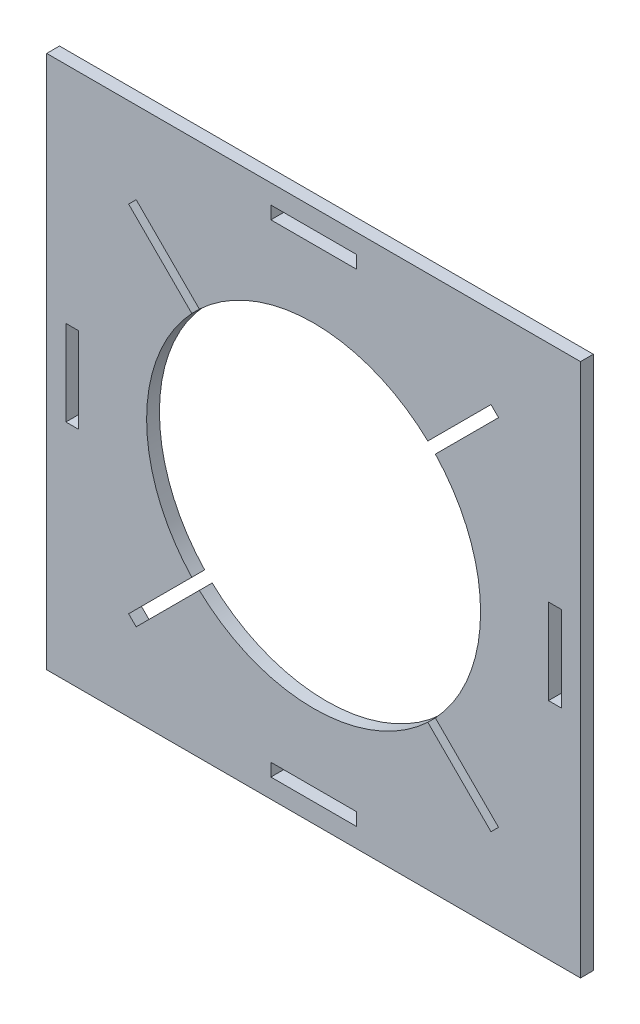
ISO-10303-21;
HEADER;
FILE_DESCRIPTION(('STEP AP214'),'2;1');
FILE_NAME('part.step','',(''),(''),'','','');
FILE_SCHEMA(('AUTOMOTIVE_DESIGN { 1 0 10303 214 1 1 1 1 }'));
ENDSEC;
DATA;
#1=APPLICATION_CONTEXT('core data for automotive mechanical design processes');
#2=APPLICATION_PROTOCOL_DEFINITION('international standard','automotive_design',2000,#1);
#3=PRODUCT_CONTEXT('',#1,'mechanical');
#4=PRODUCT('Part','Part','',(#3));
#5=PRODUCT_RELATED_PRODUCT_CATEGORY('part','',(#4));
#6=PRODUCT_DEFINITION_FORMATION('','',#4);
#7=PRODUCT_DEFINITION_CONTEXT('part definition',#1,'design');
#8=PRODUCT_DEFINITION('design','',#6,#7);
#9=PRODUCT_DEFINITION_SHAPE('','',#8);
#10=(LENGTH_UNIT() NAMED_UNIT(*) SI_UNIT(.MILLI.,.METRE.));
#11=(NAMED_UNIT(*) PLANE_ANGLE_UNIT() SI_UNIT($,.RADIAN.));
#12=(NAMED_UNIT(*) SI_UNIT($,.STERADIAN.) SOLID_ANGLE_UNIT());
#13=UNCERTAINTY_MEASURE_WITH_UNIT(LENGTH_MEASURE(1.E-05),#10,'distance_accuracy_value','');
#14=(GEOMETRIC_REPRESENTATION_CONTEXT(3) GLOBAL_UNCERTAINTY_ASSIGNED_CONTEXT((#13)) GLOBAL_UNIT_ASSIGNED_CONTEXT((#10,
#11,#12)) REPRESENTATION_CONTEXT('',''));
#15=CARTESIAN_POINT('',(0.,0.,0.));
#16=DIRECTION('',(0.,0.,1.));
#17=DIRECTION('',(1.,0.,0.));
#18=AXIS2_PLACEMENT_3D('',#15,#16,#17);
#19=CARTESIAN_POINT('',(0.,0.,0.));
#20=DIRECTION('',(0.,0.,1.));
#21=DIRECTION('',(1.,0.,0.));
#22=AXIS2_PLACEMENT_3D('',#19,#20,#21);
#23=CYLINDRICAL_SURFACE('',#22,78.2);
#24=CARTESIAN_POINT('',(0.,0.,0.));
#25=DIRECTION('',(0.,0.,1.));
#26=DIRECTION('',(1.,0.,0.));
#27=AXIS2_PLACEMENT_3D('',#24,#25,#26);
#28=CIRCLE('',#27,78.2);
#29=CARTESIAN_POINT('',(-53.4997189677804,-57.0352528737141,0.));
#30=VERTEX_POINT('',#29);
#31=CARTESIAN_POINT('',(53.4997189677812,-57.0352528737133,0.));
#32=VERTEX_POINT('',#31);
#33=EDGE_CURVE('E505',#30,#32,#28,.T.);
#34=ORIENTED_EDGE('',*,*,#33,.F.);
#35=DIRECTION('',(0.,0.,1.));
#36=VECTOR('',#35,1.);
#37=CARTESIAN_POINT('',(-53.4997189677804,-57.0352528737141,0.));
#38=LINE('',#37,#36);
#39=CARTESIAN_POINT('',(-53.4997189677804,-57.0352528737141,6.));
#40=VERTEX_POINT('',#39);
#41=EDGE_CURVE('E415',#30,#40,#38,.T.);
#42=ORIENTED_EDGE('',*,*,#41,.T.);
#43=CARTESIAN_POINT('',(0.,0.,6.));
#44=DIRECTION('',(0.,0.,1.));
#45=DIRECTION('',(1.,0.,0.));
#46=AXIS2_PLACEMENT_3D('',#43,#44,#45);
#47=CIRCLE('',#46,78.2);
#48=CARTESIAN_POINT('',(53.4997189677812,-57.0352528737133,6.));
#49=VERTEX_POINT('',#48);
#50=EDGE_CURVE('E510',#40,#49,#47,.T.);
#51=ORIENTED_EDGE('',*,*,#50,.T.);
#52=DIRECTION('',(0.,0.,1.));
#53=VECTOR('',#52,1.);
#54=CARTESIAN_POINT('',(53.4997189677812,-57.0352528737133,0.));
#55=LINE('',#54,#53);
#56=EDGE_CURVE('E434',#32,#49,#55,.T.);
#57=ORIENTED_EDGE('',*,*,#56,.F.);
#58=EDGE_LOOP('',(#34,#42,#51,#57));
#59=FACE_BOUND('',#58,.T.);
#60=ADVANCED_FACE('F33',(#59),#23,.F.);
#61=CARTESIAN_POINT('',(57.0352528737139,-53.4997189677806,0.));
#62=VERTEX_POINT('',#61);
#63=CARTESIAN_POINT('',(57.0352528737128,53.4997189677818,0.));
#64=VERTEX_POINT('',#63);
#65=EDGE_CURVE('E593',#62,#64,#28,.T.);
#66=ORIENTED_EDGE('',*,*,#65,.F.);
#67=DIRECTION('',(0.,0.,1.));
#68=VECTOR('',#67,1.);
#69=CARTESIAN_POINT('',(57.0352528737139,-53.4997189677806,0.));
#70=LINE('',#69,#68);
#71=CARTESIAN_POINT('',(57.0352528737139,-53.4997189677806,6.));
#72=VERTEX_POINT('',#71);
#73=EDGE_CURVE('E411',#62,#72,#70,.T.);
#74=ORIENTED_EDGE('',*,*,#73,.T.);
#75=CARTESIAN_POINT('',(57.0352528737128,53.4997189677818,6.));
#76=VERTEX_POINT('',#75);
#77=EDGE_CURVE('E616',#72,#76,#47,.T.);
#78=ORIENTED_EDGE('',*,*,#77,.T.);
#79=DIRECTION('',(0.,0.,1.));
#80=VECTOR('',#79,1.);
#81=CARTESIAN_POINT('',(57.0352528737128,53.4997189677818,0.));
#82=LINE('',#81,#80);
#83=EDGE_CURVE('E460',#64,#76,#82,.T.);
#84=ORIENTED_EDGE('',*,*,#83,.F.);
#85=EDGE_LOOP('',(#66,#74,#78,#84));
#86=FACE_BOUND('',#85,.T.);
#87=ADVANCED_FACE('F562',(#86),#23,.F.);
#88=CARTESIAN_POINT('',(53.49971896778,57.0352528737145,0.));
#89=VERTEX_POINT('',#88);
#90=CARTESIAN_POINT('',(-53.4997189677812,57.0352528737133,0.));
#91=VERTEX_POINT('',#90);
#92=EDGE_CURVE('E506',#89,#91,#28,.T.);
#93=ORIENTED_EDGE('',*,*,#92,.F.);
#94=DIRECTION('',(0.,0.,1.));
#95=VECTOR('',#94,1.);
#96=CARTESIAN_POINT('',(53.49971896778,57.0352528737145,0.));
#97=LINE('',#96,#95);
#98=CARTESIAN_POINT('',(53.49971896778,57.0352528737145,6.));
#99=VERTEX_POINT('',#98);
#100=EDGE_CURVE('E439',#89,#99,#97,.T.);
#101=ORIENTED_EDGE('',*,*,#100,.T.);
#102=CARTESIAN_POINT('',(-53.4997189677812,57.0352528737133,6.));
#103=VERTEX_POINT('',#102);
#104=EDGE_CURVE('E494',#99,#103,#47,.T.);
#105=ORIENTED_EDGE('',*,*,#104,.T.);
#106=DIRECTION('',(0.,0.,1.));
#107=VECTOR('',#106,1.);
#108=CARTESIAN_POINT('',(-53.4997189677812,57.0352528737133,0.));
#109=LINE('',#108,#107);
#110=EDGE_CURVE('E484',#91,#103,#109,.T.);
#111=ORIENTED_EDGE('',*,*,#110,.F.);
#112=EDGE_LOOP('',(#93,#101,#105,#111));
#113=FACE_BOUND('',#112,.T.);
#114=ADVANCED_FACE('F560',(#113),#23,.F.);
#115=CARTESIAN_POINT('',(-125.,-125.,6.));
#116=DIRECTION('',(1.,0.,0.));
#117=DIRECTION('',(0.,0.,-1.));
#118=AXIS2_PLACEMENT_3D('',#115,#116,#117);
#119=PLANE('',#118);
#120=DIRECTION('',(0.,-1.,0.));
#121=VECTOR('',#120,1.);
#122=CARTESIAN_POINT('',(-125.,-125.,0.));
#123=LINE('',#122,#121);
#124=CARTESIAN_POINT('',(-125.,125.,0.));
#125=VERTEX_POINT('',#124);
#126=CARTESIAN_POINT('',(-125.,-125.,0.));
#127=VERTEX_POINT('',#126);
#128=EDGE_CURVE('E504',#125,#127,#123,.T.);
#129=ORIENTED_EDGE('',*,*,#128,.T.);
#130=DIRECTION('',(0.,0.,-1.));
#131=VECTOR('',#130,1.);
#132=CARTESIAN_POINT('',(-125.,-125.,6.));
#133=LINE('',#132,#131);
#134=CARTESIAN_POINT('',(-125.,-125.,6.));
#135=VERTEX_POINT('',#134);
#136=EDGE_CURVE('E11',#135,#127,#133,.T.);
#137=ORIENTED_EDGE('',*,*,#136,.F.);
#138=DIRECTION('',(0.,-1.,0.));
#139=VECTOR('',#138,1.);
#140=CARTESIAN_POINT('',(-125.,-125.,6.));
#141=LINE('',#140,#139);
#142=CARTESIAN_POINT('',(-125.,125.,6.));
#143=VERTEX_POINT('',#142);
#144=EDGE_CURVE('E511',#143,#135,#141,.T.);
#145=ORIENTED_EDGE('',*,*,#144,.F.);
#146=DIRECTION('',(0.,0.,-1.));
#147=VECTOR('',#146,1.);
#148=CARTESIAN_POINT('',(-125.,125.,6.));
#149=LINE('',#148,#147);
#150=EDGE_CURVE('E521',#143,#125,#149,.T.);
#151=ORIENTED_EDGE('',*,*,#150,.T.);
#152=EDGE_LOOP('',(#129,#137,#145,#151));
#153=FACE_BOUND('',#152,.T.);
#154=ADVANCED_FACE('F35',(#153),#119,.F.);
#155=CARTESIAN_POINT('',(-125.,-125.,6.));
#156=DIRECTION('',(0.,1.,0.));
#157=DIRECTION('',(0.,0.,1.));
#158=AXIS2_PLACEMENT_3D('',#155,#156,#157);
#159=PLANE('',#158);
#160=DIRECTION('',(1.,0.,0.));
#161=VECTOR('',#160,1.);
#162=CARTESIAN_POINT('',(-125.,-125.,0.));
#163=LINE('',#162,#161);
#164=CARTESIAN_POINT('',(125.,-125.,0.));
#165=VERTEX_POINT('',#164);
#166=EDGE_CURVE('E524',#127,#165,#163,.T.);
#167=ORIENTED_EDGE('',*,*,#166,.T.);
#168=DIRECTION('',(0.,0.,-1.));
#169=VECTOR('',#168,1.);
#170=CARTESIAN_POINT('',(125.,-125.,6.));
#171=LINE('',#170,#169);
#172=CARTESIAN_POINT('',(125.,-125.,6.));
#173=VERTEX_POINT('',#172);
#174=EDGE_CURVE('E41',#173,#165,#171,.T.);
#175=ORIENTED_EDGE('',*,*,#174,.F.);
#176=DIRECTION('',(1.,0.,0.));
#177=VECTOR('',#176,1.);
#178=CARTESIAN_POINT('',(-125.,-125.,6.));
#179=LINE('',#178,#177);
#180=EDGE_CURVE('E514',#135,#173,#179,.T.);
#181=ORIENTED_EDGE('',*,*,#180,.F.);
#182=ORIENTED_EDGE('',*,*,#136,.T.);
#183=EDGE_LOOP('',(#167,#175,#181,#182));
#184=FACE_BOUND('',#183,.T.);
#185=ADVANCED_FACE('F553',(#184),#159,.F.);
#186=CARTESIAN_POINT('',(125.,-125.,6.));
#187=DIRECTION('',(-1.,0.,0.));
#188=DIRECTION('',(0.,0.,1.));
#189=AXIS2_PLACEMENT_3D('',#186,#187,#188);
#190=PLANE('',#189);
#191=DIRECTION('',(0.,1.,0.));
#192=VECTOR('',#191,1.);
#193=CARTESIAN_POINT('',(125.,-125.,0.));
#194=LINE('',#193,#192);
#195=CARTESIAN_POINT('',(125.,125.,0.));
#196=VERTEX_POINT('',#195);
#197=EDGE_CURVE('E526',#165,#196,#194,.T.);
#198=ORIENTED_EDGE('',*,*,#197,.T.);
#199=DIRECTION('',(0.,0.,-1.));
#200=VECTOR('',#199,1.);
#201=CARTESIAN_POINT('',(125.,125.,6.));
#202=LINE('',#201,#200);
#203=CARTESIAN_POINT('',(125.,125.,6.));
#204=VERTEX_POINT('',#203);
#205=EDGE_CURVE('E531',#204,#196,#202,.T.);
#206=ORIENTED_EDGE('',*,*,#205,.F.);
#207=DIRECTION('',(0.,1.,0.));
#208=VECTOR('',#207,1.);
#209=CARTESIAN_POINT('',(125.,-125.,6.));
#210=LINE('',#209,#208);
#211=EDGE_CURVE('E517',#173,#204,#210,.T.);
#212=ORIENTED_EDGE('',*,*,#211,.F.);
#213=ORIENTED_EDGE('',*,*,#174,.T.);
#214=EDGE_LOOP('',(#198,#206,#212,#213));
#215=FACE_BOUND('',#214,.T.);
#216=ADVANCED_FACE('F538',(#215),#190,.F.);
#217=CARTESIAN_POINT('',(-125.,125.,6.));
#218=DIRECTION('',(0.,-1.,0.));
#219=DIRECTION('',(0.,0.,-1.));
#220=AXIS2_PLACEMENT_3D('',#217,#218,#219);
#221=PLANE('',#220);
#222=DIRECTION('',(-1.,0.,0.));
#223=VECTOR('',#222,1.);
#224=CARTESIAN_POINT('',(-125.,125.,0.));
#225=LINE('',#224,#223);
#226=EDGE_CURVE('E515',#196,#125,#225,.T.);
#227=ORIENTED_EDGE('',*,*,#226,.T.);
#228=ORIENTED_EDGE('',*,*,#150,.F.);
#229=DIRECTION('',(-1.,0.,0.));
#230=VECTOR('',#229,1.);
#231=CARTESIAN_POINT('',(-125.,125.,6.));
#232=LINE('',#231,#230);
#233=EDGE_CURVE('E519',#204,#143,#232,.T.);
#234=ORIENTED_EDGE('',*,*,#233,.F.);
#235=ORIENTED_EDGE('',*,*,#205,.T.);
#236=EDGE_LOOP('',(#227,#228,#234,#235));
#237=FACE_BOUND('',#236,.T.);
#238=ADVANCED_FACE('F546',(#237),#221,.F.);
#239=CARTESIAN_POINT('',(0.,0.,6.));
#240=DIRECTION('',(0.,0.,-1.));
#241=DIRECTION('',(-1.,0.,0.));
#242=AXIS2_PLACEMENT_3D('',#239,#240,#241);
#243=PLANE('',#242);
#244=DIRECTION('',(0.,1.,0.));
#245=VECTOR('',#244,1.);
#246=CARTESIAN_POINT('',(-110.,-20.0000000000004,6.));
#247=LINE('',#246,#245);
#248=CARTESIAN_POINT('',(-110.,-20.0000000000004,6.));
#249=VERTEX_POINT('',#248);
#250=CARTESIAN_POINT('',(-110.,19.9999999999996,6.));
#251=VERTEX_POINT('',#250);
#252=EDGE_CURVE('E295',#249,#251,#247,.T.);
#253=ORIENTED_EDGE('',*,*,#252,.F.);
#254=DIRECTION('',(1.,0.,0.));
#255=VECTOR('',#254,1.);
#256=CARTESIAN_POINT('',(-116.,-20.0000000000004,6.));
#257=LINE('',#256,#255);
#258=CARTESIAN_POINT('',(-116.,-20.0000000000004,6.));
#259=VERTEX_POINT('',#258);
#260=EDGE_CURVE('E48',#259,#249,#257,.T.);
#261=ORIENTED_EDGE('',*,*,#260,.F.);
#262=DIRECTION('',(0.,1.,0.));
#263=VECTOR('',#262,1.);
#264=CARTESIAN_POINT('',(-116.,-20.0000000000004,6.));
#265=LINE('',#264,#263);
#266=CARTESIAN_POINT('',(-116.,19.9999999999996,6.));
#267=VERTEX_POINT('',#266);
#268=EDGE_CURVE('E286',#259,#267,#265,.T.);
#269=ORIENTED_EDGE('',*,*,#268,.T.);
#270=DIRECTION('',(1.,0.,0.));
#271=VECTOR('',#270,1.);
#272=CARTESIAN_POINT('',(-116.,19.9999999999996,6.));
#273=LINE('',#272,#271);
#274=EDGE_CURVE('E289',#267,#251,#273,.T.);
#275=ORIENTED_EDGE('',*,*,#274,.T.);
#276=EDGE_LOOP('',(#253,#261,#269,#275));
#277=FACE_BOUND('',#276,.T.);
#278=DIRECTION('',(-1.,0.,0.));
#279=VECTOR('',#278,1.);
#280=CARTESIAN_POINT('',(20.,-110.,6.));
#281=LINE('',#280,#279);
#282=CARTESIAN_POINT('',(20.,-110.,6.));
#283=VERTEX_POINT('',#282);
#284=CARTESIAN_POINT('',(-20.,-110.,6.));
#285=VERTEX_POINT('',#284);
#286=EDGE_CURVE('E320',#283,#285,#281,.T.);
#287=ORIENTED_EDGE('',*,*,#286,.F.);
#288=DIRECTION('',(0.,1.,0.));
#289=VECTOR('',#288,1.);
#290=CARTESIAN_POINT('',(20.,-116.,6.));
#291=LINE('',#290,#289);
#292=CARTESIAN_POINT('',(20.,-116.,6.));
#293=VERTEX_POINT('',#292);
#294=EDGE_CURVE('E56',#293,#283,#291,.T.);
#295=ORIENTED_EDGE('',*,*,#294,.F.);
#296=DIRECTION('',(-1.,0.,0.));
#297=VECTOR('',#296,1.);
#298=CARTESIAN_POINT('',(20.,-116.,6.));
#299=LINE('',#298,#297);
#300=CARTESIAN_POINT('',(-20.,-116.,6.));
#301=VERTEX_POINT('',#300);
#302=EDGE_CURVE('E310',#293,#301,#299,.T.);
#303=ORIENTED_EDGE('',*,*,#302,.T.);
#304=DIRECTION('',(0.,1.,0.));
#305=VECTOR('',#304,1.);
#306=CARTESIAN_POINT('',(-20.,-116.,6.));
#307=LINE('',#306,#305);
#308=EDGE_CURVE('E324',#301,#285,#307,.T.);
#309=ORIENTED_EDGE('',*,*,#308,.T.);
#310=EDGE_LOOP('',(#287,#295,#303,#309));
#311=FACE_BOUND('',#310,.T.);
#312=DIRECTION('',(0.,-1.,0.));
#313=VECTOR('',#312,1.);
#314=CARTESIAN_POINT('',(110.,20.0000000000012,6.));
#315=LINE('',#314,#313);
#316=CARTESIAN_POINT('',(110.,20.0000000000012,6.));
#317=VERTEX_POINT('',#316);
#318=CARTESIAN_POINT('',(110.,-19.9999999999988,6.));
#319=VERTEX_POINT('',#318);
#320=EDGE_CURVE('E350',#317,#319,#315,.T.);
#321=ORIENTED_EDGE('',*,*,#320,.F.);
#322=DIRECTION('',(-1.,0.,0.));
#323=VECTOR('',#322,1.);
#324=CARTESIAN_POINT('',(116.,20.0000000000012,6.));
#325=LINE('',#324,#323);
#326=CARTESIAN_POINT('',(116.,20.0000000000012,6.));
#327=VERTEX_POINT('',#326);
#328=EDGE_CURVE('E348',#327,#317,#325,.T.);
#329=ORIENTED_EDGE('',*,*,#328,.F.);
#330=DIRECTION('',(0.,-1.,0.));
#331=VECTOR('',#330,1.);
#332=CARTESIAN_POINT('',(116.,20.0000000000012,6.));
#333=LINE('',#332,#331);
#334=CARTESIAN_POINT('',(116.,-19.9999999999988,6.));
#335=VERTEX_POINT('',#334);
#336=EDGE_CURVE('E339',#327,#335,#333,.T.);
#337=ORIENTED_EDGE('',*,*,#336,.T.);
#338=DIRECTION('',(-1.,0.,0.));
#339=VECTOR('',#338,1.);
#340=CARTESIAN_POINT('',(116.,-19.9999999999988,6.));
#341=LINE('',#340,#339);
#342=EDGE_CURVE('E353',#335,#319,#341,.T.);
#343=ORIENTED_EDGE('',*,*,#342,.T.);
#344=EDGE_LOOP('',(#321,#329,#337,#343));
#345=FACE_BOUND('',#344,.T.);
#346=DIRECTION('',(1.,0.,0.));
#347=VECTOR('',#346,1.);
#348=CARTESIAN_POINT('',(-20.,110.,6.));
#349=LINE('',#348,#347);
#350=CARTESIAN_POINT('',(-20.,110.,6.));
#351=VERTEX_POINT('',#350);
#352=CARTESIAN_POINT('',(20.,110.,6.));
#353=VERTEX_POINT('',#352);
#354=EDGE_CURVE('E379',#351,#353,#349,.T.);
#355=ORIENTED_EDGE('',*,*,#354,.F.);
#356=DIRECTION('',(0.,-1.,0.));
#357=VECTOR('',#356,1.);
#358=CARTESIAN_POINT('',(-20.,116.,6.));
#359=LINE('',#358,#357);
#360=CARTESIAN_POINT('',(-20.,116.,6.));
#361=VERTEX_POINT('',#360);
#362=EDGE_CURVE('E302',#361,#351,#359,.T.);
#363=ORIENTED_EDGE('',*,*,#362,.F.);
#364=DIRECTION('',(1.,0.,0.));
#365=VECTOR('',#364,1.);
#366=CARTESIAN_POINT('',(-20.,116.,6.));
#367=LINE('',#366,#365);
#368=CARTESIAN_POINT('',(20.,116.,6.));
#369=VERTEX_POINT('',#368);
#370=EDGE_CURVE('E369',#361,#369,#367,.T.);
#371=ORIENTED_EDGE('',*,*,#370,.T.);
#372=DIRECTION('',(0.,-1.,0.));
#373=VECTOR('',#372,1.);
#374=CARTESIAN_POINT('',(20.,116.,6.));
#375=LINE('',#374,#373);
#376=EDGE_CURVE('E382',#369,#353,#375,.T.);
#377=ORIENTED_EDGE('',*,*,#376,.T.);
#378=EDGE_LOOP('',(#355,#363,#371,#377));
#379=FACE_BOUND('',#378,.T.);
#380=ORIENTED_EDGE('',*,*,#50,.F.);
#381=DIRECTION('',(0.707106781186541,0.707106781186554,0.));
#382=VECTOR('',#381,1.);
#383=CARTESIAN_POINT('',(-53.4997189677804,-57.0352528737141,6.));
#384=LINE('',#383,#382);
#385=CARTESIAN_POINT('',(-83.0850467894185,-86.6205806953528,6.));
#386=VERTEX_POINT('',#385);
#387=EDGE_CURVE('E400',#386,#40,#384,.T.);
#388=ORIENTED_EDGE('',*,*,#387,.F.);
#389=DIRECTION('',(0.707106781186554,-0.707106781186541,0.));
#390=VECTOR('',#389,1.);
#391=CARTESIAN_POINT('',(-83.0850467894185,-86.6205806953528,6.));
#392=LINE('',#391,#390);
#393=CARTESIAN_POINT('',(-86.6205806953513,-83.0850467894201,6.));
#394=VERTEX_POINT('',#393);
#395=EDGE_CURVE('E410',#394,#386,#392,.T.);
#396=ORIENTED_EDGE('',*,*,#395,.F.);
#397=DIRECTION('',(-0.707106781186541,-0.707106781186554,0.));
#398=VECTOR('',#397,1.);
#399=CARTESIAN_POINT('',(-86.6205806953513,-83.0850467894201,6.));
#400=LINE('',#399,#398);
#401=CARTESIAN_POINT('',(-57.0352528737131,-53.4997189677814,6.));
#402=VERTEX_POINT('',#401);
#403=EDGE_CURVE('E407',#402,#394,#400,.T.);
#404=ORIENTED_EDGE('',*,*,#403,.F.);
#405=CARTESIAN_POINT('',(-57.0352528737139,53.4997189677806,6.));
#406=VERTEX_POINT('',#405);
#407=EDGE_CURVE('E507',#406,#402,#47,.T.);
#408=ORIENTED_EDGE('',*,*,#407,.F.);
#409=DIRECTION('',(0.707106781186551,-0.707106781186544,0.));
#410=VECTOR('',#409,1.);
#411=CARTESIAN_POINT('',(-57.0352528737139,53.4997189677806,6.));
#412=LINE('',#411,#410);
#413=CARTESIAN_POINT('',(-86.6205806953525,83.0850467894188,6.));
#414=VERTEX_POINT('',#413);
#415=EDGE_CURVE('E478',#414,#406,#412,.T.);
#416=ORIENTED_EDGE('',*,*,#415,.F.);
#417=DIRECTION('',(-0.707106781186543,-0.707106781186552,0.));
#418=VECTOR('',#417,1.);
#419=CARTESIAN_POINT('',(-86.6205806953525,83.0850467894188,6.));
#420=LINE('',#419,#418);
#421=CARTESIAN_POINT('',(-83.0850467894198,86.6205806953516,6.));
#422=VERTEX_POINT('',#421);
#423=EDGE_CURVE('E487',#422,#414,#420,.T.);
#424=ORIENTED_EDGE('',*,*,#423,.F.);
#425=DIRECTION('',(-0.707106781186551,0.707106781186544,0.));
#426=VECTOR('',#425,1.);
#427=CARTESIAN_POINT('',(-83.0850467894198,86.6205806953516,6.));
#428=LINE('',#427,#426);
#429=EDGE_CURVE('E418',#103,#422,#428,.T.);
#430=ORIENTED_EDGE('',*,*,#429,.F.);
#431=ORIENTED_EDGE('',*,*,#104,.F.);
#432=DIRECTION('',(-0.707106781186536,-0.707106781186559,0.));
#433=VECTOR('',#432,1.);
#434=CARTESIAN_POINT('',(53.49971896778,57.0352528737145,6.));
#435=LINE('',#434,#433);
#436=CARTESIAN_POINT('',(83.0850467894179,86.6205806953534,6.));
#437=VERTEX_POINT('',#436);
#438=EDGE_CURVE('E454',#437,#99,#435,.T.);
#439=ORIENTED_EDGE('',*,*,#438,.F.);
#440=DIRECTION('',(-0.707106781186559,0.707106781186536,0.));
#441=VECTOR('',#440,1.);
#442=CARTESIAN_POINT('',(83.0850467894179,86.6205806953534,6.));
#443=LINE('',#442,#441);
#444=CARTESIAN_POINT('',(86.6205806953507,83.0850467894207,6.));
#445=VERTEX_POINT('',#444);
#446=EDGE_CURVE('E463',#445,#437,#443,.T.);
#447=ORIENTED_EDGE('',*,*,#446,.F.);
#448=DIRECTION('',(0.707106781186536,0.707106781186559,0.));
#449=VECTOR('',#448,1.);
#450=CARTESIAN_POINT('',(86.6205806953507,83.0850467894207,6.));
#451=LINE('',#450,#449);
#452=EDGE_CURVE('E389',#76,#445,#451,.T.);
#453=ORIENTED_EDGE('',*,*,#452,.F.);
#454=ORIENTED_EDGE('',*,*,#77,.F.);
#455=DIRECTION('',(-0.707106781186551,0.707106781186544,0.));
#456=VECTOR('',#455,1.);
#457=CARTESIAN_POINT('',(57.0352528737139,-53.4997189677806,6.));
#458=LINE('',#457,#456);
#459=CARTESIAN_POINT('',(86.6205806953525,-83.0850467894188,6.));
#460=VERTEX_POINT('',#459);
#461=EDGE_CURVE('E428',#460,#72,#458,.T.);
#462=ORIENTED_EDGE('',*,*,#461,.F.);
#463=DIRECTION('',(0.707106781186543,0.707106781186552,0.));
#464=VECTOR('',#463,1.);
#465=CARTESIAN_POINT('',(86.6205806953525,-83.0850467894188,6.));
#466=LINE('',#465,#464);
#467=CARTESIAN_POINT('',(83.0850467894198,-86.6205806953516,6.));
#468=VERTEX_POINT('',#467);
#469=EDGE_CURVE('E438',#468,#460,#466,.T.);
#470=ORIENTED_EDGE('',*,*,#469,.F.);
#471=DIRECTION('',(0.707106781186551,-0.707106781186544,0.));
#472=VECTOR('',#471,1.);
#473=CARTESIAN_POINT('',(83.0850467894198,-86.6205806953516,6.));
#474=LINE('',#473,#472);
#475=EDGE_CURVE('E435',#49,#468,#474,.T.);
#476=ORIENTED_EDGE('',*,*,#475,.F.);
#477=EDGE_LOOP('',(#380,#388,#396,#404,#408,#416,#424,#430,#431,#439,#447,#453,#454,#462,#470,#476));
#478=FACE_BOUND('',#477,.T.);
#479=ORIENTED_EDGE('',*,*,#144,.T.);
#480=ORIENTED_EDGE('',*,*,#180,.T.);
#481=ORIENTED_EDGE('',*,*,#211,.T.);
#482=ORIENTED_EDGE('',*,*,#233,.T.);
#483=EDGE_LOOP('',(#479,#480,#481,#482));
#484=FACE_BOUND('',#483,.T.);
#485=ADVANCED_FACE('F552',(#277,#311,#345,#379,#478,#484),#243,.F.);
#486=CARTESIAN_POINT('',(0.,0.,0.));
#487=DIRECTION('',(0.,0.,-1.));
#488=DIRECTION('',(-1.,0.,0.));
#489=AXIS2_PLACEMENT_3D('',#486,#487,#488);
#490=PLANE('',#489);
#491=DIRECTION('',(1.,0.,0.));
#492=VECTOR('',#491,1.);
#493=CARTESIAN_POINT('',(-116.,-20.0000000000004,0.));
#494=LINE('',#493,#492);
#495=CARTESIAN_POINT('',(-116.,-20.0000000000004,0.));
#496=VERTEX_POINT('',#495);
#497=CARTESIAN_POINT('',(-110.,-20.0000000000004,0.));
#498=VERTEX_POINT('',#497);
#499=EDGE_CURVE('E268',#496,#498,#494,.T.);
#500=ORIENTED_EDGE('',*,*,#499,.T.);
#501=DIRECTION('',(0.,1.,0.));
#502=VECTOR('',#501,1.);
#503=CARTESIAN_POINT('',(-110.,-20.0000000000004,0.));
#504=LINE('',#503,#502);
#505=CARTESIAN_POINT('',(-110.,19.9999999999996,0.));
#506=VERTEX_POINT('',#505);
#507=EDGE_CURVE('E277',#498,#506,#504,.T.);
#508=ORIENTED_EDGE('',*,*,#507,.T.);
#509=DIRECTION('',(1.,0.,0.));
#510=VECTOR('',#509,1.);
#511=CARTESIAN_POINT('',(-116.,19.9999999999996,0.));
#512=LINE('',#511,#510);
#513=CARTESIAN_POINT('',(-116.,19.9999999999996,0.));
#514=VERTEX_POINT('',#513);
#515=EDGE_CURVE('E282',#514,#506,#512,.T.);
#516=ORIENTED_EDGE('',*,*,#515,.F.);
#517=DIRECTION('',(0.,1.,0.));
#518=VECTOR('',#517,1.);
#519=CARTESIAN_POINT('',(-116.,-20.0000000000004,0.));
#520=LINE('',#519,#518);
#521=EDGE_CURVE('E274',#496,#514,#520,.T.);
#522=ORIENTED_EDGE('',*,*,#521,.F.);
#523=EDGE_LOOP('',(#500,#508,#516,#522));
#524=FACE_BOUND('',#523,.T.);
#525=DIRECTION('',(0.,1.,0.));
#526=VECTOR('',#525,1.);
#527=CARTESIAN_POINT('',(20.,-116.,0.));
#528=LINE('',#527,#526);
#529=CARTESIAN_POINT('',(20.,-116.,0.));
#530=VERTEX_POINT('',#529);
#531=CARTESIAN_POINT('',(20.,-110.,0.));
#532=VERTEX_POINT('',#531);
#533=EDGE_CURVE('E306',#530,#532,#528,.T.);
#534=ORIENTED_EDGE('',*,*,#533,.T.);
#535=DIRECTION('',(-1.,0.,0.));
#536=VECTOR('',#535,1.);
#537=CARTESIAN_POINT('',(20.,-110.,0.));
#538=LINE('',#537,#536);
#539=CARTESIAN_POINT('',(-20.,-110.,0.));
#540=VERTEX_POINT('',#539);
#541=EDGE_CURVE('E309',#532,#540,#538,.T.);
#542=ORIENTED_EDGE('',*,*,#541,.T.);
#543=DIRECTION('',(0.,1.,0.));
#544=VECTOR('',#543,1.);
#545=CARTESIAN_POINT('',(-20.,-116.,0.));
#546=LINE('',#545,#544);
#547=CARTESIAN_POINT('',(-20.,-116.,0.));
#548=VERTEX_POINT('',#547);
#549=EDGE_CURVE('E313',#548,#540,#546,.T.);
#550=ORIENTED_EDGE('',*,*,#549,.F.);
#551=DIRECTION('',(-1.,0.,0.));
#552=VECTOR('',#551,1.);
#553=CARTESIAN_POINT('',(20.,-116.,0.));
#554=LINE('',#553,#552);
#555=EDGE_CURVE('E316',#530,#548,#554,.T.);
#556=ORIENTED_EDGE('',*,*,#555,.F.);
#557=EDGE_LOOP('',(#534,#542,#550,#556));
#558=FACE_BOUND('',#557,.T.);
#559=DIRECTION('',(-1.,0.,0.));
#560=VECTOR('',#559,1.);
#561=CARTESIAN_POINT('',(116.,20.0000000000012,0.));
#562=LINE('',#561,#560);
#563=CARTESIAN_POINT('',(116.,20.0000000000012,0.));
#564=VERTEX_POINT('',#563);
#565=CARTESIAN_POINT('',(110.,20.0000000000012,0.));
#566=VERTEX_POINT('',#565);
#567=EDGE_CURVE('E335',#564,#566,#562,.T.);
#568=ORIENTED_EDGE('',*,*,#567,.T.);
#569=DIRECTION('',(0.,-1.,0.));
#570=VECTOR('',#569,1.);
#571=CARTESIAN_POINT('',(110.,20.0000000000012,0.));
#572=LINE('',#571,#570);
#573=CARTESIAN_POINT('',(110.,-19.9999999999988,0.));
#574=VERTEX_POINT('',#573);
#575=EDGE_CURVE('E338',#566,#574,#572,.T.);
#576=ORIENTED_EDGE('',*,*,#575,.T.);
#577=DIRECTION('',(-1.,0.,0.));
#578=VECTOR('',#577,1.);
#579=CARTESIAN_POINT('',(116.,-19.9999999999988,0.));
#580=LINE('',#579,#578);
#581=CARTESIAN_POINT('',(116.,-19.9999999999988,0.));
#582=VERTEX_POINT('',#581);
#583=EDGE_CURVE('E342',#582,#574,#580,.T.);
#584=ORIENTED_EDGE('',*,*,#583,.F.);
#585=DIRECTION('',(0.,-1.,0.));
#586=VECTOR('',#585,1.);
#587=CARTESIAN_POINT('',(116.,20.0000000000012,0.));
#588=LINE('',#587,#586);
#589=EDGE_CURVE('E345',#564,#582,#588,.T.);
#590=ORIENTED_EDGE('',*,*,#589,.F.);
#591=EDGE_LOOP('',(#568,#576,#584,#590));
#592=FACE_BOUND('',#591,.T.);
#593=DIRECTION('',(0.,-1.,0.));
#594=VECTOR('',#593,1.);
#595=CARTESIAN_POINT('',(-20.,116.,0.));
#596=LINE('',#595,#594);
#597=CARTESIAN_POINT('',(-20.,116.,0.));
#598=VERTEX_POINT('',#597);
#599=CARTESIAN_POINT('',(-20.,110.,0.));
#600=VERTEX_POINT('',#599);
#601=EDGE_CURVE('E365',#598,#600,#596,.T.);
#602=ORIENTED_EDGE('',*,*,#601,.T.);
#603=DIRECTION('',(1.,0.,0.));
#604=VECTOR('',#603,1.);
#605=CARTESIAN_POINT('',(-20.,110.,0.));
#606=LINE('',#605,#604);
#607=CARTESIAN_POINT('',(20.,110.,0.));
#608=VERTEX_POINT('',#607);
#609=EDGE_CURVE('E368',#600,#608,#606,.T.);
#610=ORIENTED_EDGE('',*,*,#609,.T.);
#611=DIRECTION('',(0.,-1.,0.));
#612=VECTOR('',#611,1.);
#613=CARTESIAN_POINT('',(20.,116.,0.));
#614=LINE('',#613,#612);
#615=CARTESIAN_POINT('',(20.,116.,0.));
#616=VERTEX_POINT('',#615);
#617=EDGE_CURVE('E372',#616,#608,#614,.T.);
#618=ORIENTED_EDGE('',*,*,#617,.F.);
#619=DIRECTION('',(1.,0.,0.));
#620=VECTOR('',#619,1.);
#621=CARTESIAN_POINT('',(-20.,116.,0.));
#622=LINE('',#621,#620);
#623=EDGE_CURVE('E375',#598,#616,#622,.T.);
#624=ORIENTED_EDGE('',*,*,#623,.F.);
#625=EDGE_LOOP('',(#602,#610,#618,#624));
#626=FACE_BOUND('',#625,.T.);
#627=DIRECTION('',(0.707106781186541,0.707106781186554,0.));
#628=VECTOR('',#627,1.);
#629=CARTESIAN_POINT('',(-53.4997189677804,-57.0352528737141,0.));
#630=LINE('',#629,#628);
#631=CARTESIAN_POINT('',(-83.0850467894185,-86.6205806953528,0.));
#632=VERTEX_POINT('',#631);
#633=EDGE_CURVE('E403',#632,#30,#630,.T.);
#634=ORIENTED_EDGE('',*,*,#633,.T.);
#635=ORIENTED_EDGE('',*,*,#33,.T.);
#636=DIRECTION('',(0.707106781186551,-0.707106781186544,0.));
#637=VECTOR('',#636,1.);
#638=CARTESIAN_POINT('',(83.0850467894198,-86.6205806953516,0.));
#639=LINE('',#638,#637);
#640=CARTESIAN_POINT('',(83.0850467894198,-86.6205806953516,0.));
#641=VERTEX_POINT('',#640);
#642=EDGE_CURVE('E424',#32,#641,#639,.T.);
#643=ORIENTED_EDGE('',*,*,#642,.T.);
#644=DIRECTION('',(0.707106781186543,0.707106781186552,0.));
#645=VECTOR('',#644,1.);
#646=CARTESIAN_POINT('',(86.6205806953525,-83.0850467894188,0.));
#647=LINE('',#646,#645);
#648=CARTESIAN_POINT('',(86.6205806953525,-83.0850467894188,0.));
#649=VERTEX_POINT('',#648);
#650=EDGE_CURVE('E427',#641,#649,#647,.T.);
#651=ORIENTED_EDGE('',*,*,#650,.T.);
#652=DIRECTION('',(-0.707106781186551,0.707106781186544,0.));
#653=VECTOR('',#652,1.);
#654=CARTESIAN_POINT('',(57.0352528737139,-53.4997189677806,0.));
#655=LINE('',#654,#653);
#656=EDGE_CURVE('E431',#649,#62,#655,.T.);
#657=ORIENTED_EDGE('',*,*,#656,.T.);
#658=ORIENTED_EDGE('',*,*,#65,.T.);
#659=DIRECTION('',(0.707106781186536,0.707106781186559,0.));
#660=VECTOR('',#659,1.);
#661=CARTESIAN_POINT('',(86.6205806953507,83.0850467894207,0.));
#662=LINE('',#661,#660);
#663=CARTESIAN_POINT('',(86.6205806953507,83.0850467894207,0.));
#664=VERTEX_POINT('',#663);
#665=EDGE_CURVE('E450',#64,#664,#662,.T.);
#666=ORIENTED_EDGE('',*,*,#665,.T.);
#667=DIRECTION('',(-0.707106781186559,0.707106781186536,0.));
#668=VECTOR('',#667,1.);
#669=CARTESIAN_POINT('',(83.0850467894179,86.6205806953534,0.));
#670=LINE('',#669,#668);
#671=CARTESIAN_POINT('',(83.0850467894179,86.6205806953534,0.));
#672=VERTEX_POINT('',#671);
#673=EDGE_CURVE('E453',#664,#672,#670,.T.);
#674=ORIENTED_EDGE('',*,*,#673,.T.);
#675=DIRECTION('',(-0.707106781186536,-0.707106781186559,0.));
#676=VECTOR('',#675,1.);
#677=CARTESIAN_POINT('',(53.49971896778,57.0352528737145,0.));
#678=LINE('',#677,#676);
#679=EDGE_CURVE('E457',#672,#89,#678,.T.);
#680=ORIENTED_EDGE('',*,*,#679,.T.);
#681=ORIENTED_EDGE('',*,*,#92,.T.);
#682=DIRECTION('',(-0.707106781186551,0.707106781186544,0.));
#683=VECTOR('',#682,1.);
#684=CARTESIAN_POINT('',(-83.0850467894198,86.6205806953516,0.));
#685=LINE('',#684,#683);
#686=CARTESIAN_POINT('',(-83.0850467894198,86.6205806953516,0.));
#687=VERTEX_POINT('',#686);
#688=EDGE_CURVE('E474',#91,#687,#685,.T.);
#689=ORIENTED_EDGE('',*,*,#688,.T.);
#690=DIRECTION('',(-0.707106781186543,-0.707106781186552,0.));
#691=VECTOR('',#690,1.);
#692=CARTESIAN_POINT('',(-86.6205806953525,83.0850467894188,0.));
#693=LINE('',#692,#691);
#694=CARTESIAN_POINT('',(-86.6205806953525,83.0850467894188,0.));
#695=VERTEX_POINT('',#694);
#696=EDGE_CURVE('E477',#687,#695,#693,.T.);
#697=ORIENTED_EDGE('',*,*,#696,.T.);
#698=DIRECTION('',(0.707106781186551,-0.707106781186544,0.));
#699=VECTOR('',#698,1.);
#700=CARTESIAN_POINT('',(-57.0352528737139,53.4997189677806,0.));
#701=LINE('',#700,#699);
#702=CARTESIAN_POINT('',(-57.0352528737139,53.4997189677806,0.));
#703=VERTEX_POINT('',#702);
#704=EDGE_CURVE('E481',#695,#703,#701,.T.);
#705=ORIENTED_EDGE('',*,*,#704,.T.);
#706=CARTESIAN_POINT('',(-57.0352528737132,-53.4997189677814,0.));
#707=VERTEX_POINT('',#706);
#708=EDGE_CURVE('E501',#703,#707,#28,.T.);
#709=ORIENTED_EDGE('',*,*,#708,.T.);
#710=DIRECTION('',(-0.707106781186541,-0.707106781186554,0.));
#711=VECTOR('',#710,1.);
#712=CARTESIAN_POINT('',(-86.6205806953513,-83.0850467894201,0.));
#713=LINE('',#712,#711);
#714=CARTESIAN_POINT('',(-86.6205806953513,-83.0850467894201,0.));
#715=VERTEX_POINT('',#714);
#716=EDGE_CURVE('E396',#707,#715,#713,.T.);
#717=ORIENTED_EDGE('',*,*,#716,.T.);
#718=DIRECTION('',(0.707106781186554,-0.707106781186541,0.));
#719=VECTOR('',#718,1.);
#720=CARTESIAN_POINT('',(-83.0850467894185,-86.6205806953528,0.));
#721=LINE('',#720,#719);
#722=EDGE_CURVE('E399',#715,#632,#721,.T.);
#723=ORIENTED_EDGE('',*,*,#722,.T.);
#724=EDGE_LOOP('',(#634,#635,#643,#651,#657,#658,#666,#674,#680,#681,#689,#697,#705,#709,#717,#723));
#725=FACE_BOUND('',#724,.T.);
#726=ORIENTED_EDGE('',*,*,#128,.F.);
#727=ORIENTED_EDGE('',*,*,#226,.F.);
#728=ORIENTED_EDGE('',*,*,#197,.F.);
#729=ORIENTED_EDGE('',*,*,#166,.F.);
#730=EDGE_LOOP('',(#726,#727,#728,#729));
#731=FACE_BOUND('',#730,.T.);
#732=ADVANCED_FACE('F284',(#524,#558,#592,#626,#725,#731),#490,.T.);
#733=ORIENTED_EDGE('',*,*,#407,.T.);
#734=DIRECTION('',(0.,0.,1.));
#735=VECTOR('',#734,1.);
#736=CARTESIAN_POINT('',(-57.0352528737131,-53.4997189677814,0.));
#737=LINE('',#736,#735);
#738=EDGE_CURVE('E406',#707,#402,#737,.T.);
#739=ORIENTED_EDGE('',*,*,#738,.F.);
#740=ORIENTED_EDGE('',*,*,#708,.F.);
#741=DIRECTION('',(0.,0.,1.));
#742=VECTOR('',#741,1.);
#743=CARTESIAN_POINT('',(-57.0352528737139,53.4997189677806,0.));
#744=LINE('',#743,#742);
#745=EDGE_CURVE('E491',#703,#406,#744,.T.);
#746=ORIENTED_EDGE('',*,*,#745,.T.);
#747=EDGE_LOOP('',(#733,#739,#740,#746));
#748=FACE_BOUND('',#747,.T.);
#749=ADVANCED_FACE('F565',(#748),#23,.F.);
#750=CARTESIAN_POINT('',(-57.0352528737139,53.4997189677806,0.));
#751=DIRECTION('',(-0.707106781186544,-0.707106781186551,0.));
#752=DIRECTION('',(0.707106781186551,-0.707106781186544,0.));
#753=AXIS2_PLACEMENT_3D('',#750,#751,#752);
#754=PLANE('',#753);
#755=ORIENTED_EDGE('',*,*,#415,.T.);
#756=ORIENTED_EDGE('',*,*,#745,.F.);
#757=ORIENTED_EDGE('',*,*,#704,.F.);
#758=DIRECTION('',(0.,0.,1.));
#759=VECTOR('',#758,1.);
#760=CARTESIAN_POINT('',(-86.6205806953525,83.0850467894188,0.));
#761=LINE('',#760,#759);
#762=EDGE_CURVE('E495',#695,#414,#761,.T.);
#763=ORIENTED_EDGE('',*,*,#762,.T.);
#764=EDGE_LOOP('',(#755,#756,#757,#763));
#765=FACE_BOUND('',#764,.T.);
#766=ADVANCED_FACE('F574',(#765),#754,.F.);
#767=CARTESIAN_POINT('',(-86.6205806953525,83.0850467894188,0.));
#768=DIRECTION('',(-0.707106781186552,0.707106781186543,0.));
#769=DIRECTION('',(-0.707106781186543,-0.707106781186552,0.));
#770=AXIS2_PLACEMENT_3D('',#767,#768,#769);
#771=PLANE('',#770);
#772=ORIENTED_EDGE('',*,*,#423,.T.);
#773=ORIENTED_EDGE('',*,*,#762,.F.);
#774=ORIENTED_EDGE('',*,*,#696,.F.);
#775=DIRECTION('',(0.,0.,1.));
#776=VECTOR('',#775,1.);
#777=CARTESIAN_POINT('',(-83.0850467894198,86.6205806953516,0.));
#778=LINE('',#777,#776);
#779=EDGE_CURVE('E497',#687,#422,#778,.T.);
#780=ORIENTED_EDGE('',*,*,#779,.T.);
#781=EDGE_LOOP('',(#772,#773,#774,#780));
#782=FACE_BOUND('',#781,.T.);
#783=ADVANCED_FACE('F580',(#782),#771,.F.);
#784=CARTESIAN_POINT('',(-83.0850467894198,86.6205806953516,0.));
#785=DIRECTION('',(0.707106781186544,0.707106781186551,0.));
#786=DIRECTION('',(-0.707106781186551,0.707106781186544,0.));
#787=AXIS2_PLACEMENT_3D('',#784,#785,#786);
#788=PLANE('',#787);
#789=ORIENTED_EDGE('',*,*,#429,.T.);
#790=ORIENTED_EDGE('',*,*,#779,.F.);
#791=ORIENTED_EDGE('',*,*,#688,.F.);
#792=ORIENTED_EDGE('',*,*,#110,.T.);
#793=EDGE_LOOP('',(#789,#790,#791,#792));
#794=FACE_BOUND('',#793,.T.);
#795=ADVANCED_FACE('F629',(#794),#788,.F.);
#796=CARTESIAN_POINT('',(53.49971896778,57.0352528737145,0.));
#797=DIRECTION('',(-0.707106781186559,0.707106781186536,0.));
#798=DIRECTION('',(-0.707106781186536,-0.707106781186559,0.));
#799=AXIS2_PLACEMENT_3D('',#796,#797,#798);
#800=PLANE('',#799);
#801=ORIENTED_EDGE('',*,*,#438,.T.);
#802=ORIENTED_EDGE('',*,*,#100,.F.);
#803=ORIENTED_EDGE('',*,*,#679,.F.);
#804=DIRECTION('',(0.,0.,1.));
#805=VECTOR('',#804,1.);
#806=CARTESIAN_POINT('',(83.0850467894179,86.6205806953534,0.));
#807=LINE('',#806,#805);
#808=EDGE_CURVE('E469',#672,#437,#807,.T.);
#809=ORIENTED_EDGE('',*,*,#808,.T.);
#810=EDGE_LOOP('',(#801,#802,#803,#809));
#811=FACE_BOUND('',#810,.T.);
#812=ADVANCED_FACE('F627',(#811),#800,.F.);
#813=CARTESIAN_POINT('',(83.0850467894179,86.6205806953534,0.));
#814=DIRECTION('',(0.707106781186536,0.707106781186559,0.));
#815=DIRECTION('',(-0.707106781186559,0.707106781186536,0.));
#816=AXIS2_PLACEMENT_3D('',#813,#814,#815);
#817=PLANE('',#816);
#818=ORIENTED_EDGE('',*,*,#446,.T.);
#819=ORIENTED_EDGE('',*,*,#808,.F.);
#820=ORIENTED_EDGE('',*,*,#673,.F.);
#821=DIRECTION('',(0.,0.,1.));
#822=VECTOR('',#821,1.);
#823=CARTESIAN_POINT('',(86.6205806953507,83.0850467894207,0.));
#824=LINE('',#823,#822);
#825=EDGE_CURVE('E471',#664,#445,#824,.T.);
#826=ORIENTED_EDGE('',*,*,#825,.T.);
#827=EDGE_LOOP('',(#818,#819,#820,#826));
#828=FACE_BOUND('',#827,.T.);
#829=ADVANCED_FACE('F623',(#828),#817,.F.);
#830=CARTESIAN_POINT('',(86.6205806953507,83.0850467894207,0.));
#831=DIRECTION('',(0.707106781186559,-0.707106781186536,0.));
#832=DIRECTION('',(0.707106781186536,0.707106781186559,0.));
#833=AXIS2_PLACEMENT_3D('',#830,#831,#832);
#834=PLANE('',#833);
#835=ORIENTED_EDGE('',*,*,#452,.T.);
#836=ORIENTED_EDGE('',*,*,#825,.F.);
#837=ORIENTED_EDGE('',*,*,#665,.F.);
#838=ORIENTED_EDGE('',*,*,#83,.T.);
#839=EDGE_LOOP('',(#835,#836,#837,#838));
#840=FACE_BOUND('',#839,.T.);
#841=ADVANCED_FACE('F619',(#840),#834,.F.);
#842=CARTESIAN_POINT('',(57.0352528737139,-53.4997189677806,0.));
#843=DIRECTION('',(0.707106781186544,0.707106781186551,0.));
#844=DIRECTION('',(-0.707106781186551,0.707106781186544,0.));
#845=AXIS2_PLACEMENT_3D('',#842,#843,#844);
#846=PLANE('',#845);
#847=ORIENTED_EDGE('',*,*,#461,.T.);
#848=ORIENTED_EDGE('',*,*,#73,.F.);
#849=ORIENTED_EDGE('',*,*,#656,.F.);
#850=DIRECTION('',(0.,0.,1.));
#851=VECTOR('',#850,1.);
#852=CARTESIAN_POINT('',(86.6205806953525,-83.0850467894188,0.));
#853=LINE('',#852,#851);
#854=EDGE_CURVE('E445',#649,#460,#853,.T.);
#855=ORIENTED_EDGE('',*,*,#854,.T.);
#856=EDGE_LOOP('',(#847,#848,#849,#855));
#857=FACE_BOUND('',#856,.T.);
#858=ADVANCED_FACE('F641',(#857),#846,.F.);
#859=CARTESIAN_POINT('',(86.6205806953525,-83.0850467894188,0.));
#860=DIRECTION('',(0.707106781186552,-0.707106781186543,0.));
#861=DIRECTION('',(0.707106781186543,0.707106781186552,0.));
#862=AXIS2_PLACEMENT_3D('',#859,#860,#861);
#863=PLANE('',#862);
#864=ORIENTED_EDGE('',*,*,#469,.T.);
#865=ORIENTED_EDGE('',*,*,#854,.F.);
#866=ORIENTED_EDGE('',*,*,#650,.F.);
#867=DIRECTION('',(0.,0.,1.));
#868=VECTOR('',#867,1.);
#869=CARTESIAN_POINT('',(83.0850467894198,-86.6205806953516,0.));
#870=LINE('',#869,#868);
#871=EDGE_CURVE('E447',#641,#468,#870,.T.);
#872=ORIENTED_EDGE('',*,*,#871,.T.);
#873=EDGE_LOOP('',(#864,#865,#866,#872));
#874=FACE_BOUND('',#873,.T.);
#875=ADVANCED_FACE('F610',(#874),#863,.F.);
#876=CARTESIAN_POINT('',(83.0850467894198,-86.6205806953516,0.));
#877=DIRECTION('',(-0.707106781186544,-0.707106781186551,0.));
#878=DIRECTION('',(0.707106781186551,-0.707106781186544,0.));
#879=AXIS2_PLACEMENT_3D('',#876,#877,#878);
#880=PLANE('',#879);
#881=ORIENTED_EDGE('',*,*,#475,.T.);
#882=ORIENTED_EDGE('',*,*,#871,.F.);
#883=ORIENTED_EDGE('',*,*,#642,.F.);
#884=ORIENTED_EDGE('',*,*,#56,.T.);
#885=EDGE_LOOP('',(#881,#882,#883,#884));
#886=FACE_BOUND('',#885,.T.);
#887=ADVANCED_FACE('F603',(#886),#880,.F.);
#888=CARTESIAN_POINT('',(-53.4997189677804,-57.0352528737141,0.));
#889=DIRECTION('',(0.707106781186553,-0.707106781186541,0.));
#890=DIRECTION('',(0.707106781186542,0.707106781186554,0.));
#891=AXIS2_PLACEMENT_3D('',#888,#889,#890);
#892=PLANE('',#891);
#893=ORIENTED_EDGE('',*,*,#387,.T.);
#894=ORIENTED_EDGE('',*,*,#41,.F.);
#895=ORIENTED_EDGE('',*,*,#633,.F.);
#896=DIRECTION('',(0.,0.,1.));
#897=VECTOR('',#896,1.);
#898=CARTESIAN_POINT('',(-83.0850467894185,-86.6205806953528,0.));
#899=LINE('',#898,#897);
#900=EDGE_CURVE('E419',#632,#386,#899,.T.);
#901=ORIENTED_EDGE('',*,*,#900,.T.);
#902=EDGE_LOOP('',(#893,#894,#895,#901));
#903=FACE_BOUND('',#902,.T.);
#904=ADVANCED_FACE('F663',(#903),#892,.F.);
#905=CARTESIAN_POINT('',(-83.0850467894185,-86.6205806953528,0.));
#906=DIRECTION('',(-0.707106781186541,-0.707106781186554,0.));
#907=DIRECTION('',(0.707106781186554,-0.707106781186541,0.));
#908=AXIS2_PLACEMENT_3D('',#905,#906,#907);
#909=PLANE('',#908);
#910=ORIENTED_EDGE('',*,*,#395,.T.);
#911=ORIENTED_EDGE('',*,*,#900,.F.);
#912=ORIENTED_EDGE('',*,*,#722,.F.);
#913=DIRECTION('',(0.,0.,1.));
#914=VECTOR('',#913,1.);
#915=CARTESIAN_POINT('',(-86.6205806953513,-83.0850467894201,0.));
#916=LINE('',#915,#914);
#917=EDGE_CURVE('E421',#715,#394,#916,.T.);
#918=ORIENTED_EDGE('',*,*,#917,.T.);
#919=EDGE_LOOP('',(#910,#911,#912,#918));
#920=FACE_BOUND('',#919,.T.);
#921=ADVANCED_FACE('F661',(#920),#909,.F.);
#922=CARTESIAN_POINT('',(-86.6205806953513,-83.0850467894201,0.));
#923=DIRECTION('',(-0.707106781186554,0.707106781186541,0.));
#924=DIRECTION('',(-0.707106781186541,-0.707106781186554,0.));
#925=AXIS2_PLACEMENT_3D('',#922,#923,#924);
#926=PLANE('',#925);
#927=ORIENTED_EDGE('',*,*,#403,.T.);
#928=ORIENTED_EDGE('',*,*,#917,.F.);
#929=ORIENTED_EDGE('',*,*,#716,.F.);
#930=ORIENTED_EDGE('',*,*,#738,.T.);
#931=EDGE_LOOP('',(#927,#928,#929,#930));
#932=FACE_BOUND('',#931,.T.);
#933=ADVANCED_FACE('F658',(#932),#926,.F.);
#934=CARTESIAN_POINT('',(-20.,116.,0.));
#935=DIRECTION('',(-1.,0.,0.));
#936=DIRECTION('',(0.,0.,1.));
#937=AXIS2_PLACEMENT_3D('',#934,#935,#936);
#938=PLANE('',#937);
#939=ORIENTED_EDGE('',*,*,#362,.T.);
#940=DIRECTION('',(0.,0.,1.));
#941=VECTOR('',#940,1.);
#942=CARTESIAN_POINT('',(-20.,110.,0.));
#943=LINE('',#942,#941);
#944=EDGE_CURVE('E377',#600,#351,#943,.T.);
#945=ORIENTED_EDGE('',*,*,#944,.F.);
#946=ORIENTED_EDGE('',*,*,#601,.F.);
#947=DIRECTION('',(0.,0.,1.));
#948=VECTOR('',#947,1.);
#949=CARTESIAN_POINT('',(-20.,116.,0.));
#950=LINE('',#949,#948);
#951=EDGE_CURVE('E387',#598,#361,#950,.T.);
#952=ORIENTED_EDGE('',*,*,#951,.T.);
#953=EDGE_LOOP('',(#939,#945,#946,#952));
#954=FACE_BOUND('',#953,.T.);
#955=ADVANCED_FACE('F672',(#954),#938,.F.);
#956=CARTESIAN_POINT('',(-20.,116.,0.));
#957=DIRECTION('',(0.,-1.,0.));
#958=DIRECTION('',(0.,0.,-1.));
#959=AXIS2_PLACEMENT_3D('',#956,#957,#958);
#960=PLANE('',#959);
#961=ORIENTED_EDGE('',*,*,#370,.F.);
#962=ORIENTED_EDGE('',*,*,#951,.F.);
#963=ORIENTED_EDGE('',*,*,#623,.T.);
#964=DIRECTION('',(0.,0.,1.));
#965=VECTOR('',#964,1.);
#966=CARTESIAN_POINT('',(20.,116.,0.));
#967=LINE('',#966,#965);
#968=EDGE_CURVE('E390',#616,#369,#967,.T.);
#969=ORIENTED_EDGE('',*,*,#968,.T.);
#970=EDGE_LOOP('',(#961,#962,#963,#969));
#971=FACE_BOUND('',#970,.T.);
#972=ADVANCED_FACE('F712',(#971),#960,.T.);
#973=CARTESIAN_POINT('',(20.,116.,0.));
#974=DIRECTION('',(-1.,0.,0.));
#975=DIRECTION('',(0.,0.,1.));
#976=AXIS2_PLACEMENT_3D('',#973,#974,#975);
#977=PLANE('',#976);
#978=ORIENTED_EDGE('',*,*,#376,.F.);
#979=ORIENTED_EDGE('',*,*,#968,.F.);
#980=ORIENTED_EDGE('',*,*,#617,.T.);
#981=DIRECTION('',(0.,0.,1.));
#982=VECTOR('',#981,1.);
#983=CARTESIAN_POINT('',(20.,110.,0.));
#984=LINE('',#983,#982);
#985=EDGE_CURVE('E392',#608,#353,#984,.T.);
#986=ORIENTED_EDGE('',*,*,#985,.T.);
#987=EDGE_LOOP('',(#978,#979,#980,#986));
#988=FACE_BOUND('',#987,.T.);
#989=ADVANCED_FACE('F721',(#988),#977,.T.);
#990=CARTESIAN_POINT('',(-20.,110.,0.));
#991=DIRECTION('',(0.,-1.,0.));
#992=DIRECTION('',(0.,0.,-1.));
#993=AXIS2_PLACEMENT_3D('',#990,#991,#992);
#994=PLANE('',#993);
#995=ORIENTED_EDGE('',*,*,#354,.T.);
#996=ORIENTED_EDGE('',*,*,#985,.F.);
#997=ORIENTED_EDGE('',*,*,#609,.F.);
#998=ORIENTED_EDGE('',*,*,#944,.T.);
#999=EDGE_LOOP('',(#995,#996,#997,#998));
#1000=FACE_BOUND('',#999,.T.);
#1001=ADVANCED_FACE('F731',(#1000),#994,.F.);
#1002=CARTESIAN_POINT('',(116.,20.0000000000012,0.));
#1003=DIRECTION('',(0.,1.,0.));
#1004=DIRECTION('',(-1.,0.,0.));
#1005=AXIS2_PLACEMENT_3D('',#1002,#1003,#1004);
#1006=PLANE('',#1005);
#1007=ORIENTED_EDGE('',*,*,#328,.T.);
#1008=DIRECTION('',(0.,0.,1.));
#1009=VECTOR('',#1008,1.);
#1010=CARTESIAN_POINT('',(110.,20.0000000000012,0.));
#1011=LINE('',#1010,#1009);
#1012=EDGE_CURVE('E347',#566,#317,#1011,.T.);
#1013=ORIENTED_EDGE('',*,*,#1012,.F.);
#1014=ORIENTED_EDGE('',*,*,#567,.F.);
#1015=DIRECTION('',(0.,0.,1.));
#1016=VECTOR('',#1015,1.);
#1017=CARTESIAN_POINT('',(116.,20.0000000000012,0.));
#1018=LINE('',#1017,#1016);
#1019=EDGE_CURVE('E321',#564,#327,#1018,.T.);
#1020=ORIENTED_EDGE('',*,*,#1019,.T.);
#1021=EDGE_LOOP('',(#1007,#1013,#1014,#1020));
#1022=FACE_BOUND('',#1021,.T.);
#1023=ADVANCED_FACE('F741',(#1022),#1006,.F.);
#1024=CARTESIAN_POINT('',(116.,20.0000000000012,0.));
#1025=DIRECTION('',(-1.,0.,0.));
#1026=DIRECTION('',(0.,-1.,0.));
#1027=AXIS2_PLACEMENT_3D('',#1024,#1025,#1026);
#1028=PLANE('',#1027);
#1029=ORIENTED_EDGE('',*,*,#336,.F.);
#1030=ORIENTED_EDGE('',*,*,#1019,.F.);
#1031=ORIENTED_EDGE('',*,*,#589,.T.);
#1032=DIRECTION('',(0.,0.,1.));
#1033=VECTOR('',#1032,1.);
#1034=CARTESIAN_POINT('',(116.,-19.9999999999988,0.));
#1035=LINE('',#1034,#1033);
#1036=EDGE_CURVE('E359',#582,#335,#1035,.T.);
#1037=ORIENTED_EDGE('',*,*,#1036,.T.);
#1038=EDGE_LOOP('',(#1029,#1030,#1031,#1037));
#1039=FACE_BOUND('',#1038,.T.);
#1040=ADVANCED_FACE('F767',(#1039),#1028,.T.);
#1041=CARTESIAN_POINT('',(116.,-19.9999999999988,0.));
#1042=DIRECTION('',(0.,1.,0.));
#1043=DIRECTION('',(-1.,0.,0.));
#1044=AXIS2_PLACEMENT_3D('',#1041,#1042,#1043);
#1045=PLANE('',#1044);
#1046=ORIENTED_EDGE('',*,*,#342,.F.);
#1047=ORIENTED_EDGE('',*,*,#1036,.F.);
#1048=ORIENTED_EDGE('',*,*,#583,.T.);
#1049=DIRECTION('',(0.,0.,1.));
#1050=VECTOR('',#1049,1.);
#1051=CARTESIAN_POINT('',(110.,-19.9999999999988,0.));
#1052=LINE('',#1051,#1050);
#1053=EDGE_CURVE('E361',#574,#319,#1052,.T.);
#1054=ORIENTED_EDGE('',*,*,#1053,.T.);
#1055=EDGE_LOOP('',(#1046,#1047,#1048,#1054));
#1056=FACE_BOUND('',#1055,.T.);
#1057=ADVANCED_FACE('F777',(#1056),#1045,.T.);
#1058=CARTESIAN_POINT('',(110.,20.0000000000012,0.));
#1059=DIRECTION('',(-1.,0.,0.));
#1060=DIRECTION('',(0.,-1.,0.));
#1061=AXIS2_PLACEMENT_3D('',#1058,#1059,#1060);
#1062=PLANE('',#1061);
#1063=ORIENTED_EDGE('',*,*,#320,.T.);
#1064=ORIENTED_EDGE('',*,*,#1053,.F.);
#1065=ORIENTED_EDGE('',*,*,#575,.F.);
#1066=ORIENTED_EDGE('',*,*,#1012,.T.);
#1067=EDGE_LOOP('',(#1063,#1064,#1065,#1066));
#1068=FACE_BOUND('',#1067,.T.);
#1069=ADVANCED_FACE('F787',(#1068),#1062,.F.);
#1070=CARTESIAN_POINT('',(20.,-116.,0.));
#1071=DIRECTION('',(1.,0.,0.));
#1072=DIRECTION('',(0.,0.,-1.));
#1073=AXIS2_PLACEMENT_3D('',#1070,#1071,#1072);
#1074=PLANE('',#1073);
#1075=ORIENTED_EDGE('',*,*,#294,.T.);
#1076=DIRECTION('',(0.,0.,1.));
#1077=VECTOR('',#1076,1.);
#1078=CARTESIAN_POINT('',(20.,-110.,0.));
#1079=LINE('',#1078,#1077);
#1080=EDGE_CURVE('E318',#532,#283,#1079,.T.);
#1081=ORIENTED_EDGE('',*,*,#1080,.F.);
#1082=ORIENTED_EDGE('',*,*,#533,.F.);
#1083=DIRECTION('',(0.,0.,1.));
#1084=VECTOR('',#1083,1.);
#1085=CARTESIAN_POINT('',(20.,-116.,0.));
#1086=LINE('',#1085,#1084);
#1087=EDGE_CURVE('E296',#530,#293,#1086,.T.);
#1088=ORIENTED_EDGE('',*,*,#1087,.T.);
#1089=EDGE_LOOP('',(#1075,#1081,#1082,#1088));
#1090=FACE_BOUND('',#1089,.T.);
#1091=ADVANCED_FACE('F797',(#1090),#1074,.F.);
#1092=CARTESIAN_POINT('',(20.,-116.,0.));
#1093=DIRECTION('',(0.,1.,0.));
#1094=DIRECTION('',(0.,0.,1.));
#1095=AXIS2_PLACEMENT_3D('',#1092,#1093,#1094);
#1096=PLANE('',#1095);
#1097=ORIENTED_EDGE('',*,*,#302,.F.);
#1098=ORIENTED_EDGE('',*,*,#1087,.F.);
#1099=ORIENTED_EDGE('',*,*,#555,.T.);
#1100=DIRECTION('',(0.,0.,1.));
#1101=VECTOR('',#1100,1.);
#1102=CARTESIAN_POINT('',(-20.,-116.,0.));
#1103=LINE('',#1102,#1101);
#1104=EDGE_CURVE('E330',#548,#301,#1103,.T.);
#1105=ORIENTED_EDGE('',*,*,#1104,.T.);
#1106=EDGE_LOOP('',(#1097,#1098,#1099,#1105));
#1107=FACE_BOUND('',#1106,.T.);
#1108=ADVANCED_FACE('F807',(#1107),#1096,.T.);
#1109=CARTESIAN_POINT('',(-20.,-116.,0.));
#1110=DIRECTION('',(1.,0.,0.));
#1111=DIRECTION('',(0.,0.,-1.));
#1112=AXIS2_PLACEMENT_3D('',#1109,#1110,#1111);
#1113=PLANE('',#1112);
#1114=ORIENTED_EDGE('',*,*,#308,.F.);
#1115=ORIENTED_EDGE('',*,*,#1104,.F.);
#1116=ORIENTED_EDGE('',*,*,#549,.T.);
#1117=DIRECTION('',(0.,0.,1.));
#1118=VECTOR('',#1117,1.);
#1119=CARTESIAN_POINT('',(-20.,-110.,0.));
#1120=LINE('',#1119,#1118);
#1121=EDGE_CURVE('E332',#540,#285,#1120,.T.);
#1122=ORIENTED_EDGE('',*,*,#1121,.T.);
#1123=EDGE_LOOP('',(#1114,#1115,#1116,#1122));
#1124=FACE_BOUND('',#1123,.T.);
#1125=ADVANCED_FACE('F816',(#1124),#1113,.T.);
#1126=CARTESIAN_POINT('',(20.,-110.,0.));
#1127=DIRECTION('',(0.,1.,0.));
#1128=DIRECTION('',(0.,0.,1.));
#1129=AXIS2_PLACEMENT_3D('',#1126,#1127,#1128);
#1130=PLANE('',#1129);
#1131=ORIENTED_EDGE('',*,*,#286,.T.);
#1132=ORIENTED_EDGE('',*,*,#1121,.F.);
#1133=ORIENTED_EDGE('',*,*,#541,.F.);
#1134=ORIENTED_EDGE('',*,*,#1080,.T.);
#1135=EDGE_LOOP('',(#1131,#1132,#1133,#1134));
#1136=FACE_BOUND('',#1135,.T.);
#1137=ADVANCED_FACE('F826',(#1136),#1130,.F.);
#1138=CARTESIAN_POINT('',(-116.,-20.0000000000004,0.));
#1139=DIRECTION('',(0.,-1.,0.));
#1140=DIRECTION('',(1.,0.,0.));
#1141=AXIS2_PLACEMENT_3D('',#1138,#1139,#1140);
#1142=PLANE('',#1141);
#1143=ORIENTED_EDGE('',*,*,#260,.T.);
#1144=DIRECTION('',(0.,0.,1.));
#1145=VECTOR('',#1144,1.);
#1146=CARTESIAN_POINT('',(-110.,-20.0000000000004,0.));
#1147=LINE('',#1146,#1145);
#1148=EDGE_CURVE('E264',#498,#249,#1147,.T.);
#1149=ORIENTED_EDGE('',*,*,#1148,.F.);
#1150=ORIENTED_EDGE('',*,*,#499,.F.);
#1151=DIRECTION('',(0.,0.,1.));
#1152=VECTOR('',#1151,1.);
#1153=CARTESIAN_POINT('',(-116.,-20.0000000000004,0.));
#1154=LINE('',#1153,#1152);
#1155=EDGE_CURVE('E300',#496,#259,#1154,.T.);
#1156=ORIENTED_EDGE('',*,*,#1155,.T.);
#1157=EDGE_LOOP('',(#1143,#1149,#1150,#1156));
#1158=FACE_BOUND('',#1157,.T.);
#1159=ADVANCED_FACE('F266',(#1158),#1142,.F.);
#1160=CARTESIAN_POINT('',(-116.,-20.0000000000004,0.));
#1161=DIRECTION('',(1.,0.,0.));
#1162=DIRECTION('',(0.,1.,0.));
#1163=AXIS2_PLACEMENT_3D('',#1160,#1161,#1162);
#1164=PLANE('',#1163);
#1165=ORIENTED_EDGE('',*,*,#268,.F.);
#1166=ORIENTED_EDGE('',*,*,#1155,.F.);
#1167=ORIENTED_EDGE('',*,*,#521,.T.);
#1168=DIRECTION('',(0.,0.,1.));
#1169=VECTOR('',#1168,1.);
#1170=CARTESIAN_POINT('',(-116.,19.9999999999996,0.));
#1171=LINE('',#1170,#1169);
#1172=EDGE_CURVE('E303',#514,#267,#1171,.T.);
#1173=ORIENTED_EDGE('',*,*,#1172,.T.);
#1174=EDGE_LOOP('',(#1165,#1166,#1167,#1173));
#1175=FACE_BOUND('',#1174,.T.);
#1176=ADVANCED_FACE('F845',(#1175),#1164,.T.);
#1177=CARTESIAN_POINT('',(-116.,19.9999999999996,0.));
#1178=DIRECTION('',(0.,-1.,0.));
#1179=DIRECTION('',(1.,0.,0.));
#1180=AXIS2_PLACEMENT_3D('',#1177,#1178,#1179);
#1181=PLANE('',#1180);
#1182=ORIENTED_EDGE('',*,*,#274,.F.);
#1183=ORIENTED_EDGE('',*,*,#1172,.F.);
#1184=ORIENTED_EDGE('',*,*,#515,.T.);
#1185=DIRECTION('',(0.,0.,1.));
#1186=VECTOR('',#1185,1.);
#1187=CARTESIAN_POINT('',(-110.,19.9999999999996,0.));
#1188=LINE('',#1187,#1186);
#1189=EDGE_CURVE('E273',#506,#251,#1188,.T.);
#1190=ORIENTED_EDGE('',*,*,#1189,.T.);
#1191=EDGE_LOOP('',(#1182,#1183,#1184,#1190));
#1192=FACE_BOUND('',#1191,.T.);
#1193=ADVANCED_FACE('F854',(#1192),#1181,.T.);
#1194=CARTESIAN_POINT('',(-110.,-20.0000000000004,0.));
#1195=DIRECTION('',(1.,0.,0.));
#1196=DIRECTION('',(0.,1.,0.));
#1197=AXIS2_PLACEMENT_3D('',#1194,#1195,#1196);
#1198=PLANE('',#1197);
#1199=ORIENTED_EDGE('',*,*,#252,.T.);
#1200=ORIENTED_EDGE('',*,*,#1189,.F.);
#1201=ORIENTED_EDGE('',*,*,#507,.F.);
#1202=ORIENTED_EDGE('',*,*,#1148,.T.);
#1203=EDGE_LOOP('',(#1199,#1200,#1201,#1202));
#1204=FACE_BOUND('',#1203,.T.);
#1205=ADVANCED_FACE('F278',(#1204),#1198,.F.);
#1206=CLOSED_SHELL('',(#60,#87,#114,#154,#185,#216,#238,#485,#732,#749,#766,#783,#795,#812,#829,
#841,#858,#875,#887,#904,#921,#933,#955,#972,#989,#1001,#1023,#1040,#1057,#1069,#1091,#1108,
#1125,#1137,#1159,#1176,#1193,#1205));
#1207=MANIFOLD_SOLID_BREP('B2',#1206);
#1208=ADVANCED_BREP_SHAPE_REPRESENTATION('',(#18,#1207),#14);
#1209=SHAPE_DEFINITION_REPRESENTATION(#9,#1208);
ENDSEC;
END-ISO-10303-21;
